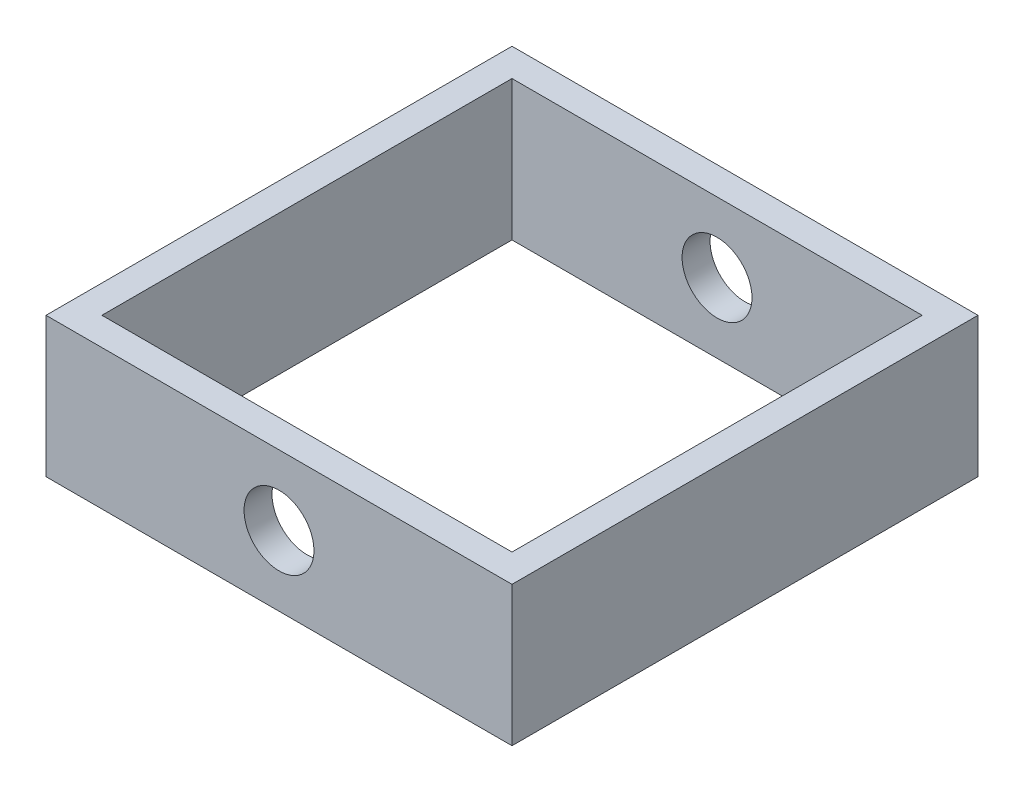
ISO-10303-21;
HEADER;
FILE_DESCRIPTION(('STEP AP214'),'2;1');
FILE_NAME('part.step','',(''),(''),'','','');
FILE_SCHEMA(('AUTOMOTIVE_DESIGN { 1 0 10303 214 1 1 1 1 }'));
ENDSEC;
DATA;
#1=APPLICATION_CONTEXT('core data for automotive mechanical design processes');
#2=APPLICATION_PROTOCOL_DEFINITION('international standard','automotive_design',2000,#1);
#3=PRODUCT_CONTEXT('',#1,'mechanical');
#4=PRODUCT('Part','Part','',(#3));
#5=PRODUCT_RELATED_PRODUCT_CATEGORY('part','',(#4));
#6=PRODUCT_DEFINITION_FORMATION('','',#4);
#7=PRODUCT_DEFINITION_CONTEXT('part definition',#1,'design');
#8=PRODUCT_DEFINITION('design','',#6,#7);
#9=PRODUCT_DEFINITION_SHAPE('','',#8);
#10=(LENGTH_UNIT() NAMED_UNIT(*) SI_UNIT(.MILLI.,.METRE.));
#11=(NAMED_UNIT(*) PLANE_ANGLE_UNIT() SI_UNIT($,.RADIAN.));
#12=(NAMED_UNIT(*) SI_UNIT($,.STERADIAN.) SOLID_ANGLE_UNIT());
#13=UNCERTAINTY_MEASURE_WITH_UNIT(LENGTH_MEASURE(1.E-05),#10,'distance_accuracy_value','');
#14=(GEOMETRIC_REPRESENTATION_CONTEXT(3) GLOBAL_UNCERTAINTY_ASSIGNED_CONTEXT((#13)) GLOBAL_UNIT_ASSIGNED_CONTEXT((#10,
#11,#12)) REPRESENTATION_CONTEXT('',''));
#15=CARTESIAN_POINT('',(0.,0.,0.));
#16=DIRECTION('',(0.,0.,1.));
#17=DIRECTION('',(1.,0.,0.));
#18=AXIS2_PLACEMENT_3D('',#15,#16,#17);
#19=CARTESIAN_POINT('',(0.,30.,0.));
#20=DIRECTION('',(0.,-1.,0.));
#21=DIRECTION('',(0.,0.,-1.));
#22=AXIS2_PLACEMENT_3D('',#19,#20,#21);
#23=PLANE('',#22);
#24=DIRECTION('',(0.,0.,1.));
#25=VECTOR('',#24,1.);
#26=CARTESIAN_POINT('',(0.,30.,0.));
#27=LINE('',#26,#25);
#28=CARTESIAN_POINT('',(0.,30.,-100.));
#29=VERTEX_POINT('',#28);
#30=CARTESIAN_POINT('',(0.,30.,0.));
#31=VERTEX_POINT('',#30);
#32=EDGE_CURVE('E161',#29,#31,#27,.T.);
#33=ORIENTED_EDGE('',*,*,#32,.T.);
#34=DIRECTION('',(1.,0.,0.));
#35=VECTOR('',#34,1.);
#36=CARTESIAN_POINT('',(0.,30.,0.));
#37=LINE('',#36,#35);
#38=CARTESIAN_POINT('',(100.,30.,0.));
#39=VERTEX_POINT('',#38);
#40=EDGE_CURVE('E165',#31,#39,#37,.T.);
#41=ORIENTED_EDGE('',*,*,#40,.T.);
#42=DIRECTION('',(0.,0.,-1.));
#43=VECTOR('',#42,1.);
#44=CARTESIAN_POINT('',(100.,30.,0.));
#45=LINE('',#44,#43);
#46=CARTESIAN_POINT('',(100.,30.,-100.));
#47=VERTEX_POINT('',#46);
#48=EDGE_CURVE('E169',#39,#47,#45,.T.);
#49=ORIENTED_EDGE('',*,*,#48,.T.);
#50=DIRECTION('',(-1.,0.,0.));
#51=VECTOR('',#50,1.);
#52=CARTESIAN_POINT('',(0.,30.,-100.));
#53=LINE('',#52,#51);
#54=EDGE_CURVE('E172',#47,#29,#53,.T.);
#55=ORIENTED_EDGE('',*,*,#54,.T.);
#56=EDGE_LOOP('',(#33,#41,#49,#55));
#57=FACE_BOUND('',#56,.T.);
#58=DIRECTION('',(1.,0.,0.));
#59=VECTOR('',#58,1.);
#60=CARTESIAN_POINT('',(6.,30.,-6.));
#61=LINE('',#60,#59);
#62=CARTESIAN_POINT('',(6.,30.,-6.));
#63=VERTEX_POINT('',#62);
#64=CARTESIAN_POINT('',(94.,30.,-6.));
#65=VERTEX_POINT('',#64);
#66=EDGE_CURVE('E111',#63,#65,#61,.T.);
#67=ORIENTED_EDGE('',*,*,#66,.F.);
#68=DIRECTION('',(0.,0.,1.));
#69=VECTOR('',#68,1.);
#70=CARTESIAN_POINT('',(6.,30.,-6.));
#71=LINE('',#70,#69);
#72=CARTESIAN_POINT('',(6.,30.,-94.));
#73=VERTEX_POINT('',#72);
#74=EDGE_CURVE('E137',#73,#63,#71,.T.);
#75=ORIENTED_EDGE('',*,*,#74,.F.);
#76=DIRECTION('',(-1.,0.,0.));
#77=VECTOR('',#76,1.);
#78=CARTESIAN_POINT('',(6.,30.,-94.));
#79=LINE('',#78,#77);
#80=CARTESIAN_POINT('',(94.,30.,-94.));
#81=VERTEX_POINT('',#80);
#82=EDGE_CURVE('E133',#81,#73,#79,.T.);
#83=ORIENTED_EDGE('',*,*,#82,.F.);
#84=DIRECTION('',(0.,0.,-1.));
#85=VECTOR('',#84,1.);
#86=CARTESIAN_POINT('',(94.,30.,-6.));
#87=LINE('',#86,#85);
#88=EDGE_CURVE('E120',#65,#81,#87,.T.);
#89=ORIENTED_EDGE('',*,*,#88,.F.);
#90=EDGE_LOOP('',(#67,#75,#83,#89));
#91=FACE_BOUND('',#90,.T.);
#92=ADVANCED_FACE('F44',(#57,#91),#23,.F.);
#93=CARTESIAN_POINT('',(0.,0.,0.));
#94=DIRECTION('',(0.,-1.,0.));
#95=DIRECTION('',(0.,0.,-1.));
#96=AXIS2_PLACEMENT_3D('',#93,#94,#95);
#97=PLANE('',#96);
#98=DIRECTION('',(0.,0.,1.));
#99=VECTOR('',#98,1.);
#100=CARTESIAN_POINT('',(0.,0.,0.));
#101=LINE('',#100,#99);
#102=CARTESIAN_POINT('',(0.,0.,-100.));
#103=VERTEX_POINT('',#102);
#104=CARTESIAN_POINT('',(0.,0.,0.));
#105=VERTEX_POINT('',#104);
#106=EDGE_CURVE('E129',#103,#105,#101,.T.);
#107=ORIENTED_EDGE('',*,*,#106,.F.);
#108=DIRECTION('',(-1.,0.,0.));
#109=VECTOR('',#108,1.);
#110=CARTESIAN_POINT('',(0.,0.,-100.));
#111=LINE('',#110,#109);
#112=CARTESIAN_POINT('',(100.,0.,-100.));
#113=VERTEX_POINT('',#112);
#114=EDGE_CURVE('E166',#113,#103,#111,.T.);
#115=ORIENTED_EDGE('',*,*,#114,.F.);
#116=DIRECTION('',(0.,0.,-1.));
#117=VECTOR('',#116,1.);
#118=CARTESIAN_POINT('',(100.,0.,0.));
#119=LINE('',#118,#117);
#120=CARTESIAN_POINT('',(100.,0.,0.));
#121=VERTEX_POINT('',#120);
#122=EDGE_CURVE('E182',#121,#113,#119,.T.);
#123=ORIENTED_EDGE('',*,*,#122,.F.);
#124=DIRECTION('',(1.,0.,0.));
#125=VECTOR('',#124,1.);
#126=CARTESIAN_POINT('',(0.,0.,0.));
#127=LINE('',#126,#125);
#128=EDGE_CURVE('E179',#105,#121,#127,.T.);
#129=ORIENTED_EDGE('',*,*,#128,.F.);
#130=EDGE_LOOP('',(#107,#115,#123,#129));
#131=FACE_BOUND('',#130,.T.);
#132=DIRECTION('',(0.,0.,1.));
#133=VECTOR('',#132,1.);
#134=CARTESIAN_POINT('',(6.,0.,-6.));
#135=LINE('',#134,#133);
#136=CARTESIAN_POINT('',(6.,0.,-94.));
#137=VERTEX_POINT('',#136);
#138=CARTESIAN_POINT('',(6.,0.,-6.));
#139=VERTEX_POINT('',#138);
#140=EDGE_CURVE('E121',#137,#139,#135,.T.);
#141=ORIENTED_EDGE('',*,*,#140,.T.);
#142=DIRECTION('',(1.,0.,0.));
#143=VECTOR('',#142,1.);
#144=CARTESIAN_POINT('',(6.,0.,-6.));
#145=LINE('',#144,#143);
#146=CARTESIAN_POINT('',(94.,0.,-6.));
#147=VERTEX_POINT('',#146);
#148=EDGE_CURVE('E69',#139,#147,#145,.T.);
#149=ORIENTED_EDGE('',*,*,#148,.T.);
#150=DIRECTION('',(0.,0.,-1.));
#151=VECTOR('',#150,1.);
#152=CARTESIAN_POINT('',(94.,0.,-6.));
#153=LINE('',#152,#151);
#154=CARTESIAN_POINT('',(94.,0.,-94.));
#155=VERTEX_POINT('',#154);
#156=EDGE_CURVE('E127',#147,#155,#153,.T.);
#157=ORIENTED_EDGE('',*,*,#156,.T.);
#158=DIRECTION('',(-1.,0.,0.));
#159=VECTOR('',#158,1.);
#160=CARTESIAN_POINT('',(6.,0.,-94.));
#161=LINE('',#160,#159);
#162=EDGE_CURVE('E148',#155,#137,#161,.T.);
#163=ORIENTED_EDGE('',*,*,#162,.T.);
#164=EDGE_LOOP('',(#141,#149,#157,#163));
#165=FACE_BOUND('',#164,.T.);
#166=ADVANCED_FACE('F206',(#131,#165),#97,.T.);
#167=CARTESIAN_POINT('',(0.,30.,0.));
#168=DIRECTION('',(1.,0.,0.));
#169=DIRECTION('',(0.,0.,-1.));
#170=AXIS2_PLACEMENT_3D('',#167,#168,#169);
#171=PLANE('',#170);
#172=ORIENTED_EDGE('',*,*,#106,.T.);
#173=DIRECTION('',(0.,-1.,0.));
#174=VECTOR('',#173,1.);
#175=CARTESIAN_POINT('',(0.,30.,0.));
#176=LINE('',#175,#174);
#177=EDGE_CURVE('E11',#31,#105,#176,.T.);
#178=ORIENTED_EDGE('',*,*,#177,.F.);
#179=ORIENTED_EDGE('',*,*,#32,.F.);
#180=DIRECTION('',(0.,-1.,0.));
#181=VECTOR('',#180,1.);
#182=CARTESIAN_POINT('',(0.,30.,-100.));
#183=LINE('',#182,#181);
#184=EDGE_CURVE('E175',#29,#103,#183,.T.);
#185=ORIENTED_EDGE('',*,*,#184,.T.);
#186=EDGE_LOOP('',(#172,#178,#179,#185));
#187=FACE_BOUND('',#186,.T.);
#188=ADVANCED_FACE('F46',(#187),#171,.F.);
#189=CARTESIAN_POINT('',(0.,30.,0.));
#190=DIRECTION('',(0.,0.,-1.));
#191=DIRECTION('',(-1.,0.,0.));
#192=AXIS2_PLACEMENT_3D('',#189,#190,#191);
#193=PLANE('',#192);
#194=CARTESIAN_POINT('',(50.,15.,0.));
#195=DIRECTION('',(0.,0.,1.));
#196=DIRECTION('',(1.,0.,0.));
#197=AXIS2_PLACEMENT_3D('',#194,#195,#196);
#198=CIRCLE('',#197,7.5);
#199=CARTESIAN_POINT('',(57.5,15.,0.));
#200=VERTEX_POINT('',#199);
#201=EDGE_CURVE('E245',#200,#200,#198,.T.);
#202=ORIENTED_EDGE('',*,*,#201,.F.);
#203=EDGE_LOOP('',(#202));
#204=FACE_BOUND('',#203,.T.);
#205=ORIENTED_EDGE('',*,*,#128,.T.);
#206=DIRECTION('',(0.,-1.,0.));
#207=VECTOR('',#206,1.);
#208=CARTESIAN_POINT('',(100.,30.,0.));
#209=LINE('',#208,#207);
#210=EDGE_CURVE('E54',#39,#121,#209,.T.);
#211=ORIENTED_EDGE('',*,*,#210,.F.);
#212=ORIENTED_EDGE('',*,*,#40,.F.);
#213=ORIENTED_EDGE('',*,*,#177,.T.);
#214=EDGE_LOOP('',(#205,#211,#212,#213));
#215=FACE_BOUND('',#214,.T.);
#216=ADVANCED_FACE('F216',(#204,#215),#193,.F.);
#217=CARTESIAN_POINT('',(100.,30.,0.));
#218=DIRECTION('',(-1.,0.,0.));
#219=DIRECTION('',(0.,0.,1.));
#220=AXIS2_PLACEMENT_3D('',#217,#218,#219);
#221=PLANE('',#220);
#222=ORIENTED_EDGE('',*,*,#122,.T.);
#223=DIRECTION('',(0.,-1.,0.));
#224=VECTOR('',#223,1.);
#225=CARTESIAN_POINT('',(100.,30.,-100.));
#226=LINE('',#225,#224);
#227=EDGE_CURVE('E190',#47,#113,#226,.T.);
#228=ORIENTED_EDGE('',*,*,#227,.F.);
#229=ORIENTED_EDGE('',*,*,#48,.F.);
#230=ORIENTED_EDGE('',*,*,#210,.T.);
#231=EDGE_LOOP('',(#222,#228,#229,#230));
#232=FACE_BOUND('',#231,.T.);
#233=ADVANCED_FACE('F200',(#232),#221,.F.);
#234=CARTESIAN_POINT('',(0.,30.,-100.));
#235=DIRECTION('',(0.,0.,1.));
#236=DIRECTION('',(1.,0.,0.));
#237=AXIS2_PLACEMENT_3D('',#234,#235,#236);
#238=PLANE('',#237);
#239=CARTESIAN_POINT('',(50.,15.,-100.));
#240=DIRECTION('',(0.,0.,1.));
#241=DIRECTION('',(1.,0.,0.));
#242=AXIS2_PLACEMENT_3D('',#239,#240,#241);
#243=CIRCLE('',#242,7.5);
#244=CARTESIAN_POINT('',(57.5,15.,-100.));
#245=VERTEX_POINT('',#244);
#246=EDGE_CURVE('E242',#245,#245,#243,.T.);
#247=ORIENTED_EDGE('',*,*,#246,.T.);
#248=EDGE_LOOP('',(#247));
#249=FACE_BOUND('',#248,.T.);
#250=ORIENTED_EDGE('',*,*,#114,.T.);
#251=ORIENTED_EDGE('',*,*,#184,.F.);
#252=ORIENTED_EDGE('',*,*,#54,.F.);
#253=ORIENTED_EDGE('',*,*,#227,.T.);
#254=EDGE_LOOP('',(#250,#251,#252,#253));
#255=FACE_BOUND('',#254,.T.);
#256=ADVANCED_FACE('F210',(#249,#255),#238,.F.);
#257=CARTESIAN_POINT('',(6.,30.,-6.));
#258=DIRECTION('',(0.,0.,-1.));
#259=DIRECTION('',(-1.,0.,0.));
#260=AXIS2_PLACEMENT_3D('',#257,#258,#259);
#261=PLANE('',#260);
#262=CARTESIAN_POINT('',(50.,15.,-6.00000000000001));
#263=DIRECTION('',(0.,0.,-1.));
#264=DIRECTION('',(-1.,0.,0.));
#265=AXIS2_PLACEMENT_3D('',#262,#263,#264);
#266=CIRCLE('',#265,7.5);
#267=CARTESIAN_POINT('',(42.5,15.,-6.00000000000001));
#268=VERTEX_POINT('',#267);
#269=EDGE_CURVE('E145',#268,#268,#266,.T.);
#270=ORIENTED_EDGE('',*,*,#269,.F.);
#271=EDGE_LOOP('',(#270));
#272=FACE_BOUND('',#271,.T.);
#273=ORIENTED_EDGE('',*,*,#148,.F.);
#274=DIRECTION('',(0.,-1.,0.));
#275=VECTOR('',#274,1.);
#276=CARTESIAN_POINT('',(6.,30.,-6.));
#277=LINE('',#276,#275);
#278=EDGE_CURVE('E115',#63,#139,#277,.T.);
#279=ORIENTED_EDGE('',*,*,#278,.F.);
#280=ORIENTED_EDGE('',*,*,#66,.T.);
#281=DIRECTION('',(0.,-1.,0.));
#282=VECTOR('',#281,1.);
#283=CARTESIAN_POINT('',(94.,30.,-6.));
#284=LINE('',#283,#282);
#285=EDGE_CURVE('E114',#65,#147,#284,.T.);
#286=ORIENTED_EDGE('',*,*,#285,.T.);
#287=EDGE_LOOP('',(#273,#279,#280,#286));
#288=FACE_BOUND('',#287,.T.);
#289=ADVANCED_FACE('F113',(#272,#288),#261,.T.);
#290=CARTESIAN_POINT('',(94.,30.,-6.));
#291=DIRECTION('',(-1.,0.,0.));
#292=DIRECTION('',(0.,0.,1.));
#293=AXIS2_PLACEMENT_3D('',#290,#291,#292);
#294=PLANE('',#293);
#295=ORIENTED_EDGE('',*,*,#156,.F.);
#296=ORIENTED_EDGE('',*,*,#285,.F.);
#297=ORIENTED_EDGE('',*,*,#88,.T.);
#298=DIRECTION('',(0.,-1.,0.));
#299=VECTOR('',#298,1.);
#300=CARTESIAN_POINT('',(94.,30.,-94.));
#301=LINE('',#300,#299);
#302=EDGE_CURVE('E130',#81,#155,#301,.T.);
#303=ORIENTED_EDGE('',*,*,#302,.T.);
#304=EDGE_LOOP('',(#295,#296,#297,#303));
#305=FACE_BOUND('',#304,.T.);
#306=ADVANCED_FACE('F124',(#305),#294,.T.);
#307=CARTESIAN_POINT('',(6.,30.,-94.));
#308=DIRECTION('',(0.,0.,1.));
#309=DIRECTION('',(1.,0.,0.));
#310=AXIS2_PLACEMENT_3D('',#307,#308,#309);
#311=PLANE('',#310);
#312=CARTESIAN_POINT('',(50.,15.,-94.));
#313=DIRECTION('',(0.,0.,1.));
#314=DIRECTION('',(1.,0.,0.));
#315=AXIS2_PLACEMENT_3D('',#312,#313,#314);
#316=CIRCLE('',#315,7.5);
#317=CARTESIAN_POINT('',(57.5,15.,-94.));
#318=VERTEX_POINT('',#317);
#319=EDGE_CURVE('E48',#318,#318,#316,.T.);
#320=ORIENTED_EDGE('',*,*,#319,.F.);
#321=EDGE_LOOP('',(#320));
#322=FACE_BOUND('',#321,.T.);
#323=ORIENTED_EDGE('',*,*,#162,.F.);
#324=ORIENTED_EDGE('',*,*,#302,.F.);
#325=ORIENTED_EDGE('',*,*,#82,.T.);
#326=DIRECTION('',(0.,-1.,0.));
#327=VECTOR('',#326,1.);
#328=CARTESIAN_POINT('',(6.,30.,-94.));
#329=LINE('',#328,#327);
#330=EDGE_CURVE('E61',#73,#137,#329,.T.);
#331=ORIENTED_EDGE('',*,*,#330,.T.);
#332=EDGE_LOOP('',(#323,#324,#325,#331));
#333=FACE_BOUND('',#332,.T.);
#334=ADVANCED_FACE('F269',(#322,#333),#311,.T.);
#335=CARTESIAN_POINT('',(6.,30.,-6.));
#336=DIRECTION('',(1.,0.,0.));
#337=DIRECTION('',(0.,0.,-1.));
#338=AXIS2_PLACEMENT_3D('',#335,#336,#337);
#339=PLANE('',#338);
#340=ORIENTED_EDGE('',*,*,#140,.F.);
#341=ORIENTED_EDGE('',*,*,#330,.F.);
#342=ORIENTED_EDGE('',*,*,#74,.T.);
#343=ORIENTED_EDGE('',*,*,#278,.T.);
#344=EDGE_LOOP('',(#340,#341,#342,#343));
#345=FACE_BOUND('',#344,.T.);
#346=ADVANCED_FACE('F264',(#345),#339,.T.);
#347=CARTESIAN_POINT('',(50.,15.,-100.));
#348=DIRECTION('',(0.,0.,1.));
#349=DIRECTION('',(1.,0.,0.));
#350=AXIS2_PLACEMENT_3D('',#347,#348,#349);
#351=CYLINDRICAL_SURFACE('',#350,7.5);
#352=ORIENTED_EDGE('',*,*,#319,.T.);
#353=EDGE_LOOP('',(#352));
#354=FACE_BOUND('',#353,.T.);
#355=ORIENTED_EDGE('',*,*,#246,.F.);
#356=EDGE_LOOP('',(#355));
#357=FACE_BOUND('',#356,.T.);
#358=ADVANCED_FACE('F259',(#354,#357),#351,.F.);
#359=ORIENTED_EDGE('',*,*,#269,.T.);
#360=EDGE_LOOP('',(#359));
#361=FACE_BOUND('',#360,.T.);
#362=ORIENTED_EDGE('',*,*,#201,.T.);
#363=EDGE_LOOP('',(#362));
#364=FACE_BOUND('',#363,.T.);
#365=ADVANCED_FACE('F256',(#361,#364),#351,.F.);
#366=CLOSED_SHELL('',(#92,#166,#188,#216,#233,#256,#289,#306,#334,#346,#358,#365));
#367=MANIFOLD_SOLID_BREP('B2',#366);
#368=ADVANCED_BREP_SHAPE_REPRESENTATION('',(#18,#367),#14);
#369=SHAPE_DEFINITION_REPRESENTATION(#9,#368);
ENDSEC;
END-ISO-10303-21;
